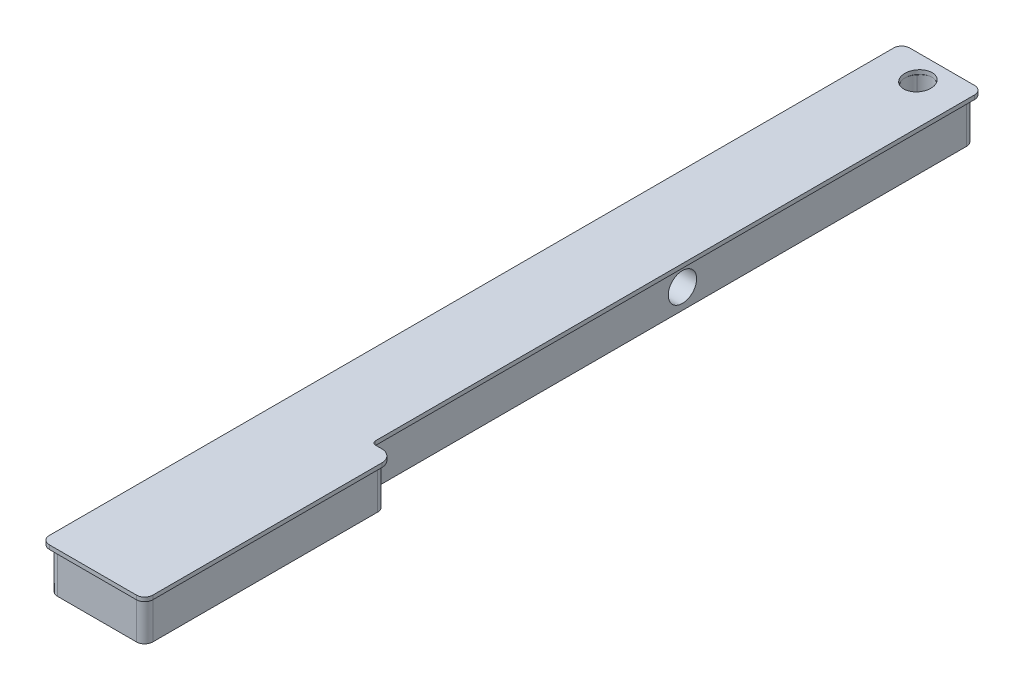
ISO-10303-21;
HEADER;
FILE_DESCRIPTION(('STEP AP214'),'2;1');
FILE_NAME('part.step','',(''),(''),'','','');
FILE_SCHEMA(('AUTOMOTIVE_DESIGN { 1 0 10303 214 1 1 1 1 }'));
ENDSEC;
DATA;
#1=APPLICATION_CONTEXT('core data for automotive mechanical design processes');
#2=APPLICATION_PROTOCOL_DEFINITION('international standard','automotive_design',2000,#1);
#3=PRODUCT_CONTEXT('',#1,'mechanical');
#4=PRODUCT('Part','Part','',(#3));
#5=PRODUCT_RELATED_PRODUCT_CATEGORY('part','',(#4));
#6=PRODUCT_DEFINITION_FORMATION('','',#4);
#7=PRODUCT_DEFINITION_CONTEXT('part definition',#1,'design');
#8=PRODUCT_DEFINITION('design','',#6,#7);
#9=PRODUCT_DEFINITION_SHAPE('','',#8);
#10=(LENGTH_UNIT() NAMED_UNIT(*) SI_UNIT(.MILLI.,.METRE.));
#11=(NAMED_UNIT(*) PLANE_ANGLE_UNIT() SI_UNIT($,.RADIAN.));
#12=(NAMED_UNIT(*) SI_UNIT($,.STERADIAN.) SOLID_ANGLE_UNIT());
#13=UNCERTAINTY_MEASURE_WITH_UNIT(LENGTH_MEASURE(1.E-05),#10,'distance_accuracy_value','');
#14=(GEOMETRIC_REPRESENTATION_CONTEXT(3) GLOBAL_UNCERTAINTY_ASSIGNED_CONTEXT((#13)) GLOBAL_UNIT_ASSIGNED_CONTEXT((#10,
#11,#12)) REPRESENTATION_CONTEXT('',''));
#15=CARTESIAN_POINT('',(0.,0.,0.));
#16=DIRECTION('',(0.,0.,1.));
#17=DIRECTION('',(1.,0.,0.));
#18=AXIS2_PLACEMENT_3D('',#15,#16,#17);
#19=CARTESIAN_POINT('',(-2.35185760733097,0.,-100.));
#20=DIRECTION('',(0.,1.,0.));
#21=DIRECTION('',(0.,0.,1.));
#22=AXIS2_PLACEMENT_3D('',#19,#20,#21);
#23=CYLINDRICAL_SURFACE('',#22,3.2);
#24=CARTESIAN_POINT('',(-2.35185760733097,10.,-100.));
#25=DIRECTION('',(0.,-1.,0.));
#26=DIRECTION('',(0.,0.,-1.));
#27=AXIS2_PLACEMENT_3D('',#24,#25,#26);
#28=CIRCLE('',#27,3.2);
#29=CARTESIAN_POINT('',(-4.71112737701685,10.,-102.161907989218));
#30=VERTEX_POINT('',#29);
#31=CARTESIAN_POINT('',(-5.55185760733097,10.,-100.));
#32=VERTEX_POINT('',#31);
#33=EDGE_CURVE('E48',#30,#32,#28,.F.);
#34=ORIENTED_EDGE('',*,*,#33,.T.);
#35=CARTESIAN_POINT('',(-4.71112737701678,10.,-97.8380920107816));
#36=VERTEX_POINT('',#35);
#37=EDGE_CURVE('E11',#32,#36,#28,.F.);
#38=ORIENTED_EDGE('',*,*,#37,.T.);
#39=DIRECTION('',(0.,1.,0.));
#40=VECTOR('',#39,1.);
#41=CARTESIAN_POINT('',(-4.71112737701686,0.,-97.8380920107817));
#42=LINE('',#41,#40);
#43=CARTESIAN_POINT('',(-4.71112737701686,0.,-97.8380920107817));
#44=VERTEX_POINT('',#43);
#45=EDGE_CURVE('E271',#44,#36,#42,.T.);
#46=ORIENTED_EDGE('',*,*,#45,.F.);
#47=CARTESIAN_POINT('',(-2.35185760733097,0.,-100.));
#48=DIRECTION('',(0.,1.,0.));
#49=DIRECTION('',(0.,0.,1.));
#50=AXIS2_PLACEMENT_3D('',#47,#48,#49);
#51=CIRCLE('',#50,3.2);
#52=CARTESIAN_POINT('',(-4.71112737701686,0.,-102.161907989218));
#53=VERTEX_POINT('',#52);
#54=EDGE_CURVE('E287',#53,#44,#51,.T.);
#55=ORIENTED_EDGE('',*,*,#54,.F.);
#56=DIRECTION('',(0.,1.,0.));
#57=VECTOR('',#56,1.);
#58=CARTESIAN_POINT('',(-4.71112737701686,0.,-102.161907989218));
#59=LINE('',#58,#57);
#60=EDGE_CURVE('E497',#30,#53,#59,.F.);
#61=ORIENTED_EDGE('',*,*,#60,.F.);
#62=EDGE_LOOP('',(#34,#38,#46,#55,#61));
#63=FACE_BOUND('',#62,.T.);
#64=ADVANCED_FACE('F39',(#63),#23,.F.);
#65=CARTESIAN_POINT('',(-2.35185760733097,0.,-100.));
#66=DIRECTION('',(0.,1.,0.));
#67=DIRECTION('',(0.,0.,-1.));
#68=AXIS2_PLACEMENT_3D('',#65,#66,#67);
#69=ELLIPSE('',#68,3.5,2.99999999999999);
#70=DIRECTION('',(0.,1.,0.));
#71=VECTOR('',#70,1.);
#72=SURFACE_OF_LINEAR_EXTRUSION('',#69,#71);
#73=CARTESIAN_POINT('',(-2.35185760733097,10.,-100.));
#74=DIRECTION('',(0.,1.,0.));
#75=DIRECTION('',(0.,0.,-1.));
#76=AXIS2_PLACEMENT_3D('',#73,#74,#75);
#77=ELLIPSE('',#76,3.5,2.99999999999999);
#78=CARTESIAN_POINT('',(-2.35185760733097,10.,-96.5000000000001));
#79=VERTEX_POINT('',#78);
#80=EDGE_CURVE('E265',#36,#79,#77,.T.);
#81=ORIENTED_EDGE('',*,*,#80,.T.);
#82=CARTESIAN_POINT('',(-2.35185760733097,10.,-100.));
#83=DIRECTION('',(0.,1.,0.));
#84=DIRECTION('',(0.,0.,-1.));
#85=AXIS2_PLACEMENT_3D('',#82,#83,#84);
#86=ELLIPSE('',#85,3.5,2.99999999999999);
#87=CARTESIAN_POINT('',(0.00741216235491515,10.,-97.8380920107817));
#88=VERTEX_POINT('',#87);
#89=EDGE_CURVE('E238',#79,#88,#86,.T.);
#90=ORIENTED_EDGE('',*,*,#89,.T.);
#91=DIRECTION('',(0.,1.,0.));
#92=VECTOR('',#91,1.);
#93=CARTESIAN_POINT('',(0.00741216235491688,0.,-97.8380920107817));
#94=LINE('',#93,#92);
#95=CARTESIAN_POINT('',(0.00741216235492122,0.,-97.8380920107817));
#96=VERTEX_POINT('',#95);
#97=EDGE_CURVE('E392',#88,#96,#94,.F.);
#98=ORIENTED_EDGE('',*,*,#97,.T.);
#99=EDGE_CURVE('E277',#44,#96,#69,.T.);
#100=ORIENTED_EDGE('',*,*,#99,.F.);
#101=ORIENTED_EDGE('',*,*,#45,.T.);
#102=EDGE_LOOP('',(#81,#90,#98,#100,#101));
#103=FACE_BOUND('',#102,.T.);
#104=ADVANCED_FACE('F269',(#103),#72,.F.);
#105=CARTESIAN_POINT('',(-11.3462483619855,10.,-33.0000000000001));
#106=DIRECTION('',(1.,0.,0.));
#107=DIRECTION('',(0.,0.,-1.));
#108=AXIS2_PLACEMENT_3D('',#105,#106,#107);
#109=PLANE('',#108);
#110=CARTESIAN_POINT('',(-11.3462483619855,4.99999999999999,-33.0000000000001));
#111=DIRECTION('',(1.,0.,0.));
#112=DIRECTION('',(0.,0.,-1.));
#113=AXIS2_PLACEMENT_3D('',#110,#111,#112);
#114=CIRCLE('',#113,3.5);
#115=CARTESIAN_POINT('',(-11.3462483619855,4.99999999999999,-36.5000000000001));
#116=VERTEX_POINT('',#115);
#117=EDGE_CURVE('E719',#116,#116,#114,.T.);
#118=ORIENTED_EDGE('',*,*,#117,.T.);
#119=EDGE_LOOP('',(#118));
#120=FACE_BOUND('',#119,.T.);
#121=DIRECTION('',(0.,0.,1.));
#122=VECTOR('',#121,1.);
#123=CARTESIAN_POINT('',(-11.3462483619855,10.,-33.0000000000001));
#124=LINE('',#123,#122);
#125=CARTESIAN_POINT('',(-11.3462483619855,10.,-103.));
#126=VERTEX_POINT('',#125);
#127=CARTESIAN_POINT('',(-11.3462483619855,10.,103.));
#128=VERTEX_POINT('',#127);
#129=EDGE_CURVE('E725',#126,#128,#124,.T.);
#130=ORIENTED_EDGE('',*,*,#129,.F.);
#131=DIRECTION('',(0.,-1.,0.));
#132=VECTOR('',#131,1.);
#133=CARTESIAN_POINT('',(-11.3462483619855,10.,-103.));
#134=LINE('',#133,#132);
#135=CARTESIAN_POINT('',(-11.3462483619855,0.,-103.));
#136=VERTEX_POINT('',#135);
#137=EDGE_CURVE('E437',#126,#136,#134,.T.);
#138=ORIENTED_EDGE('',*,*,#137,.T.);
#139=DIRECTION('',(0.,0.,1.));
#140=VECTOR('',#139,1.);
#141=CARTESIAN_POINT('',(-11.3462483619855,0.,-33.0000000000001));
#142=LINE('',#141,#140);
#143=CARTESIAN_POINT('',(-11.3462483619855,0.,103.));
#144=VERTEX_POINT('',#143);
#145=EDGE_CURVE('E722',#136,#144,#142,.T.);
#146=ORIENTED_EDGE('',*,*,#145,.T.);
#147=DIRECTION('',(0.,-1.,0.));
#148=VECTOR('',#147,1.);
#149=CARTESIAN_POINT('',(-11.3462483619855,10.,103.));
#150=LINE('',#149,#148);
#151=EDGE_CURVE('E435',#144,#128,#150,.F.);
#152=ORIENTED_EDGE('',*,*,#151,.T.);
#153=EDGE_LOOP('',(#130,#138,#146,#152));
#154=FACE_BOUND('',#153,.T.);
#155=ADVANCED_FACE('F331',(#120,#154),#109,.F.);
#156=CARTESIAN_POINT('',(-11.3462483619855,10.,105.));
#157=DIRECTION('',(0.,0.,-1.));
#158=DIRECTION('',(-1.,0.,0.));
#159=AXIS2_PLACEMENT_3D('',#156,#157,#158);
#160=PLANE('',#159);
#161=DIRECTION('',(1.,0.,0.));
#162=VECTOR('',#161,1.);
#163=CARTESIAN_POINT('',(-11.3462483619855,10.,105.));
#164=LINE('',#163,#162);
#165=CARTESIAN_POINT('',(-9.34624836198546,10.,105.));
#166=VERTEX_POINT('',#165);
#167=CARTESIAN_POINT('',(10.1337516380145,10.,105.));
#168=VERTEX_POINT('',#167);
#169=EDGE_CURVE('E728',#166,#168,#164,.T.);
#170=ORIENTED_EDGE('',*,*,#169,.F.);
#171=DIRECTION('',(0.,-1.,0.));
#172=VECTOR('',#171,1.);
#173=CARTESIAN_POINT('',(-9.34624836198546,10.,105.));
#174=LINE('',#173,#172);
#175=CARTESIAN_POINT('',(-9.34624836198546,0.,105.));
#176=VERTEX_POINT('',#175);
#177=EDGE_CURVE('E452',#166,#176,#174,.T.);
#178=ORIENTED_EDGE('',*,*,#177,.T.);
#179=DIRECTION('',(1.,0.,0.));
#180=VECTOR('',#179,1.);
#181=CARTESIAN_POINT('',(-11.3462483619855,0.,105.));
#182=LINE('',#181,#180);
#183=CARTESIAN_POINT('',(10.1337516380145,0.,105.));
#184=VERTEX_POINT('',#183);
#185=EDGE_CURVE('E746',#176,#184,#182,.T.);
#186=ORIENTED_EDGE('',*,*,#185,.T.);
#187=DIRECTION('',(0.,-1.,0.));
#188=VECTOR('',#187,1.);
#189=CARTESIAN_POINT('',(10.1337516380145,10.,105.));
#190=LINE('',#189,#188);
#191=EDGE_CURVE('E450',#184,#168,#190,.F.);
#192=ORIENTED_EDGE('',*,*,#191,.T.);
#193=EDGE_LOOP('',(#170,#178,#186,#192));
#194=FACE_BOUND('',#193,.T.);
#195=ADVANCED_FACE('F327',(#194),#160,.F.);
#196=CARTESIAN_POINT('',(12.1337516380145,10.,45.5658663131516));
#197=DIRECTION('',(-1.,0.,0.));
#198=DIRECTION('',(0.,0.,1.));
#199=AXIS2_PLACEMENT_3D('',#196,#197,#198);
#200=PLANE('',#199);
#201=DIRECTION('',(0.,0.,-1.));
#202=VECTOR('',#201,1.);
#203=CARTESIAN_POINT('',(12.1337516380145,0.,45.5658663131516));
#204=LINE('',#203,#202);
#205=CARTESIAN_POINT('',(12.1337516380145,0.,103.));
#206=VERTEX_POINT('',#205);
#207=CARTESIAN_POINT('',(12.1337516380145,0.,47.5658663131516));
#208=VERTEX_POINT('',#207);
#209=EDGE_CURVE('E749',#206,#208,#204,.T.);
#210=ORIENTED_EDGE('',*,*,#209,.T.);
#211=DIRECTION('',(0.,-1.,0.));
#212=VECTOR('',#211,1.);
#213=CARTESIAN_POINT('',(12.1337516380145,10.,47.5658663131516));
#214=LINE('',#213,#212);
#215=CARTESIAN_POINT('',(12.1337516380145,10.,47.5658663131516));
#216=VERTEX_POINT('',#215);
#217=EDGE_CURVE('E448',#208,#216,#214,.F.);
#218=ORIENTED_EDGE('',*,*,#217,.T.);
#219=DIRECTION('',(0.,0.,-1.));
#220=VECTOR('',#219,1.);
#221=CARTESIAN_POINT('',(12.1337516380145,10.,45.5658663131516));
#222=LINE('',#221,#220);
#223=CARTESIAN_POINT('',(12.1337516380145,10.,103.));
#224=VERTEX_POINT('',#223);
#225=EDGE_CURVE('E732',#224,#216,#222,.T.);
#226=ORIENTED_EDGE('',*,*,#225,.F.);
#227=DIRECTION('',(0.,-1.,0.));
#228=VECTOR('',#227,1.);
#229=CARTESIAN_POINT('',(12.1337516380145,10.,103.));
#230=LINE('',#229,#228);
#231=EDGE_CURVE('E445',#224,#206,#230,.T.);
#232=ORIENTED_EDGE('',*,*,#231,.T.);
#233=EDGE_LOOP('',(#210,#218,#226,#232));
#234=FACE_BOUND('',#233,.T.);
#235=ADVANCED_FACE('F323',(#234),#200,.F.);
#236=CARTESIAN_POINT('',(6.635965382195,10.,45.5658663131516));
#237=DIRECTION('',(0.,0.,1.));
#238=DIRECTION('',(1.,0.,0.));
#239=AXIS2_PLACEMENT_3D('',#236,#237,#238);
#240=PLANE('',#239);
#241=DIRECTION('',(-1.,0.,0.));
#242=VECTOR('',#241,1.);
#243=CARTESIAN_POINT('',(6.635965382195,0.,45.5658663131516));
#244=LINE('',#243,#242);
#245=CARTESIAN_POINT('',(10.1337516380145,0.,45.5658663131516));
#246=VERTEX_POINT('',#245);
#247=CARTESIAN_POINT('',(8.63596538219499,0.,45.5658663131516));
#248=VERTEX_POINT('',#247);
#249=EDGE_CURVE('E752',#246,#248,#244,.T.);
#250=ORIENTED_EDGE('',*,*,#249,.T.);
#251=DIRECTION('',(0.,-1.,0.));
#252=VECTOR('',#251,1.);
#253=CARTESIAN_POINT('',(8.63596538219499,10.,45.5658663131516));
#254=LINE('',#253,#252);
#255=CARTESIAN_POINT('',(8.63596538219499,10.,45.5658663131516));
#256=VERTEX_POINT('',#255);
#257=EDGE_CURVE('E443',#248,#256,#254,.F.);
#258=ORIENTED_EDGE('',*,*,#257,.T.);
#259=DIRECTION('',(-1.,0.,0.));
#260=VECTOR('',#259,1.);
#261=CARTESIAN_POINT('',(6.635965382195,10.,45.5658663131516));
#262=LINE('',#261,#260);
#263=CARTESIAN_POINT('',(10.1337516380145,10.,45.5658663131516));
#264=VERTEX_POINT('',#263);
#265=EDGE_CURVE('E735',#264,#256,#262,.T.);
#266=ORIENTED_EDGE('',*,*,#265,.F.);
#267=DIRECTION('',(0.,-1.,0.));
#268=VECTOR('',#267,1.);
#269=CARTESIAN_POINT('',(10.1337516380145,10.,45.5658663131516));
#270=LINE('',#269,#268);
#271=EDGE_CURVE('E440',#264,#246,#270,.T.);
#272=ORIENTED_EDGE('',*,*,#271,.T.);
#273=EDGE_LOOP('',(#250,#258,#266,#272));
#274=FACE_BOUND('',#273,.T.);
#275=ADVANCED_FACE('F319',(#274),#240,.F.);
#276=CARTESIAN_POINT('',(6.63596538219499,10.,-105.));
#277=DIRECTION('',(-1.,0.,0.));
#278=DIRECTION('',(0.,0.,1.));
#279=AXIS2_PLACEMENT_3D('',#276,#277,#278);
#280=PLANE('',#279);
#281=CARTESIAN_POINT('',(6.63596538219499,4.99999999999999,-33.0000000000001));
#282=DIRECTION('',(1.,0.,0.));
#283=DIRECTION('',(0.,0.,-1.));
#284=AXIS2_PLACEMENT_3D('',#281,#282,#283);
#285=CIRCLE('',#284,3.5);
#286=CARTESIAN_POINT('',(6.63596538219499,4.99999999999999,-36.5000000000001));
#287=VERTEX_POINT('',#286);
#288=EDGE_CURVE('E717',#287,#287,#285,.T.);
#289=ORIENTED_EDGE('',*,*,#288,.F.);
#290=EDGE_LOOP('',(#289));
#291=FACE_BOUND('',#290,.T.);
#292=DIRECTION('',(0.,0.,-1.));
#293=VECTOR('',#292,1.);
#294=CARTESIAN_POINT('',(6.63596538219499,0.,-105.));
#295=LINE('',#294,#293);
#296=CARTESIAN_POINT('',(6.63596538219499,0.,43.5658663131516));
#297=VERTEX_POINT('',#296);
#298=CARTESIAN_POINT('',(6.63596538219499,0.,-103.));
#299=VERTEX_POINT('',#298);
#300=EDGE_CURVE('E755',#297,#299,#295,.T.);
#301=ORIENTED_EDGE('',*,*,#300,.T.);
#302=DIRECTION('',(0.,-1.,0.));
#303=VECTOR('',#302,1.);
#304=CARTESIAN_POINT('',(6.63596538219499,10.,-103.));
#305=LINE('',#304,#303);
#306=CARTESIAN_POINT('',(6.635965382195,10.,-103.));
#307=VERTEX_POINT('',#306);
#308=EDGE_CURVE('E418',#299,#307,#305,.F.);
#309=ORIENTED_EDGE('',*,*,#308,.T.);
#310=DIRECTION('',(0.,0.,-1.));
#311=VECTOR('',#310,1.);
#312=CARTESIAN_POINT('',(6.635965382195,10.,45.0032966559117));
#313=LINE('',#312,#311);
#314=CARTESIAN_POINT('',(6.635965382195,10.,43.5658663131516));
#315=VERTEX_POINT('',#314);
#316=EDGE_CURVE('E738',#315,#307,#313,.T.);
#317=ORIENTED_EDGE('',*,*,#316,.F.);
#318=DIRECTION('',(0.,-1.,0.));
#319=VECTOR('',#318,1.);
#320=CARTESIAN_POINT('',(6.63596538219499,0.,43.5658663131516));
#321=LINE('',#320,#319);
#322=EDGE_CURVE('E415',#315,#297,#321,.T.);
#323=ORIENTED_EDGE('',*,*,#322,.T.);
#324=EDGE_LOOP('',(#301,#309,#317,#323));
#325=FACE_BOUND('',#324,.T.);
#326=ADVANCED_FACE('F315',(#291,#325),#280,.F.);
#327=CARTESIAN_POINT('',(-11.3462483619855,10.,-105.));
#328=DIRECTION('',(0.,0.,1.));
#329=DIRECTION('',(1.,0.,0.));
#330=AXIS2_PLACEMENT_3D('',#327,#328,#329);
#331=PLANE('',#330);
#332=DIRECTION('',(-1.,0.,0.));
#333=VECTOR('',#332,1.);
#334=CARTESIAN_POINT('',(-11.3462483619855,10.,-105.));
#335=LINE('',#334,#333);
#336=CARTESIAN_POINT('',(4.63596538219499,10.,-105.));
#337=VERTEX_POINT('',#336);
#338=CARTESIAN_POINT('',(-9.34624836198549,10.,-105.));
#339=VERTEX_POINT('',#338);
#340=EDGE_CURVE('E741',#337,#339,#335,.T.);
#341=ORIENTED_EDGE('',*,*,#340,.F.);
#342=DIRECTION('',(0.,-1.,0.));
#343=VECTOR('',#342,1.);
#344=CARTESIAN_POINT('',(4.63596538219499,10.,-105.));
#345=LINE('',#344,#343);
#346=CARTESIAN_POINT('',(4.63596538219499,0.,-105.));
#347=VERTEX_POINT('',#346);
#348=EDGE_CURVE('E397',#337,#347,#345,.T.);
#349=ORIENTED_EDGE('',*,*,#348,.T.);
#350=DIRECTION('',(-1.,0.,0.));
#351=VECTOR('',#350,1.);
#352=CARTESIAN_POINT('',(-11.3462483619855,0.,-105.));
#353=LINE('',#352,#351);
#354=CARTESIAN_POINT('',(-9.34624836198549,0.,-105.));
#355=VERTEX_POINT('',#354);
#356=EDGE_CURVE('E729',#347,#355,#353,.T.);
#357=ORIENTED_EDGE('',*,*,#356,.T.);
#358=DIRECTION('',(0.,-1.,0.));
#359=VECTOR('',#358,1.);
#360=CARTESIAN_POINT('',(-9.34624836198549,10.,-105.));
#361=LINE('',#360,#359);
#362=EDGE_CURVE('E394',#355,#339,#361,.F.);
#363=ORIENTED_EDGE('',*,*,#362,.T.);
#364=EDGE_LOOP('',(#341,#349,#357,#363));
#365=FACE_BOUND('',#364,.T.);
#366=ADVANCED_FACE('F312',(#365),#331,.F.);
#367=CARTESIAN_POINT('',(0.,0.,0.));
#368=DIRECTION('',(0.,-1.,0.));
#369=DIRECTION('',(0.,0.,-1.));
#370=AXIS2_PLACEMENT_3D('',#367,#368,#369);
#371=PLANE('',#370);
#372=CARTESIAN_POINT('',(0.00741216235492122,0.,-102.161907989218));
#373=VERTEX_POINT('',#372);
#374=EDGE_CURVE('E282',#96,#373,#51,.T.);
#375=ORIENTED_EDGE('',*,*,#374,.T.);
#376=EDGE_CURVE('E272',#373,#53,#69,.T.);
#377=ORIENTED_EDGE('',*,*,#376,.T.);
#378=ORIENTED_EDGE('',*,*,#54,.T.);
#379=ORIENTED_EDGE('',*,*,#99,.T.);
#380=EDGE_LOOP('',(#375,#377,#378,#379));
#381=FACE_BOUND('',#380,.T.);
#382=ORIENTED_EDGE('',*,*,#356,.F.);
#383=CARTESIAN_POINT('',(4.63596538219499,0.,-103.));
#384=DIRECTION('',(0.,-1.,0.));
#385=DIRECTION('',(0.,0.,-1.));
#386=AXIS2_PLACEMENT_3D('',#383,#384,#385);
#387=CIRCLE('',#386,2.);
#388=EDGE_CURVE('E413',#347,#299,#387,.T.);
#389=ORIENTED_EDGE('',*,*,#388,.T.);
#390=ORIENTED_EDGE('',*,*,#300,.F.);
#391=CARTESIAN_POINT('',(8.63596538219499,0.,43.5658663131516));
#392=DIRECTION('',(0.,-1.,0.));
#393=DIRECTION('',(0.,0.,-1.));
#394=AXIS2_PLACEMENT_3D('',#391,#392,#393);
#395=CIRCLE('',#394,2.);
#396=EDGE_CURVE('E455',#297,#248,#395,.F.);
#397=ORIENTED_EDGE('',*,*,#396,.T.);
#398=ORIENTED_EDGE('',*,*,#249,.F.);
#399=CARTESIAN_POINT('',(10.1337516380145,0.,47.5658663131516));
#400=DIRECTION('',(0.,-1.,0.));
#401=DIRECTION('',(0.,0.,-1.));
#402=AXIS2_PLACEMENT_3D('',#399,#400,#401);
#403=CIRCLE('',#402,2.);
#404=EDGE_CURVE('E409',#246,#208,#403,.T.);
#405=ORIENTED_EDGE('',*,*,#404,.T.);
#406=ORIENTED_EDGE('',*,*,#209,.F.);
#407=CARTESIAN_POINT('',(10.1337516380145,0.,103.));
#408=DIRECTION('',(0.,-1.,0.));
#409=DIRECTION('',(0.,0.,-1.));
#410=AXIS2_PLACEMENT_3D('',#407,#408,#409);
#411=CIRCLE('',#410,2.);
#412=EDGE_CURVE('E405',#206,#184,#411,.T.);
#413=ORIENTED_EDGE('',*,*,#412,.T.);
#414=ORIENTED_EDGE('',*,*,#185,.F.);
#415=CARTESIAN_POINT('',(-9.34624836198546,0.,103.));
#416=DIRECTION('',(0.,-1.,0.));
#417=DIRECTION('',(0.,0.,-1.));
#418=AXIS2_PLACEMENT_3D('',#415,#416,#417);
#419=CIRCLE('',#418,2.);
#420=EDGE_CURVE('E407',#176,#144,#419,.T.);
#421=ORIENTED_EDGE('',*,*,#420,.T.);
#422=ORIENTED_EDGE('',*,*,#145,.F.);
#423=CARTESIAN_POINT('',(-9.34624836198549,0.,-103.));
#424=DIRECTION('',(0.,-1.,0.));
#425=DIRECTION('',(0.,0.,-1.));
#426=AXIS2_PLACEMENT_3D('',#423,#424,#425);
#427=CIRCLE('',#426,2.);
#428=EDGE_CURVE('E411',#136,#355,#427,.T.);
#429=ORIENTED_EDGE('',*,*,#428,.T.);
#430=EDGE_LOOP('',(#382,#389,#390,#397,#398,#405,#406,#413,#414,#421,#422,#429));
#431=FACE_BOUND('',#430,.T.);
#432=ADVANCED_FACE('F308',(#381,#431),#371,.T.);
#433=CARTESIAN_POINT('',(-67.364034617805,4.99999999999999,-33.0000000000001));
#434=DIRECTION('',(1.,0.,0.));
#435=DIRECTION('',(0.,0.,-1.));
#436=AXIS2_PLACEMENT_3D('',#433,#434,#435);
#437=CYLINDRICAL_SURFACE('',#436,3.5);
#438=ORIENTED_EDGE('',*,*,#288,.T.);
#439=EDGE_LOOP('',(#438));
#440=FACE_BOUND('',#439,.T.);
#441=ORIENTED_EDGE('',*,*,#117,.F.);
#442=EDGE_LOOP('',(#441));
#443=FACE_BOUND('',#442,.T.);
#444=ADVANCED_FACE('F304',(#440,#443),#437,.F.);
#445=ORIENTED_EDGE('',*,*,#376,.F.);
#446=DIRECTION('',(0.,1.,0.));
#447=VECTOR('',#446,1.);
#448=CARTESIAN_POINT('',(0.00741216235491948,0.,-102.161907989218));
#449=LINE('',#448,#447);
#450=CARTESIAN_POINT('',(0.00741216235485139,10.,-102.161907989219));
#451=VERTEX_POINT('',#450);
#452=EDGE_CURVE('E395',#373,#451,#449,.T.);
#453=ORIENTED_EDGE('',*,*,#452,.T.);
#454=CARTESIAN_POINT('',(-2.35185760733097,10.,-103.5));
#455=VERTEX_POINT('',#454);
#456=EDGE_CURVE('E273',#451,#455,#77,.T.);
#457=ORIENTED_EDGE('',*,*,#456,.T.);
#458=EDGE_CURVE('E275',#455,#30,#77,.T.);
#459=ORIENTED_EDGE('',*,*,#458,.T.);
#460=ORIENTED_EDGE('',*,*,#60,.T.);
#461=EDGE_LOOP('',(#445,#453,#457,#459,#460));
#462=FACE_BOUND('',#461,.T.);
#463=ADVANCED_FACE('F299',(#462),#72,.F.);
#464=ORIENTED_EDGE('',*,*,#97,.F.);
#465=CARTESIAN_POINT('',(0.848142392669032,10.,-100.));
#466=VERTEX_POINT('',#465);
#467=EDGE_CURVE('E244',#88,#466,#28,.F.);
#468=ORIENTED_EDGE('',*,*,#467,.T.);
#469=EDGE_CURVE('E43',#466,#451,#28,.F.);
#470=ORIENTED_EDGE('',*,*,#469,.T.);
#471=ORIENTED_EDGE('',*,*,#452,.F.);
#472=ORIENTED_EDGE('',*,*,#374,.F.);
#473=EDGE_LOOP('',(#464,#468,#470,#471,#472));
#474=FACE_BOUND('',#473,.T.);
#475=ADVANCED_FACE('F303',(#474),#23,.F.);
#476=CARTESIAN_POINT('',(4.63596538219499,10.,-103.));
#477=DIRECTION('',(0.,-1.,0.));
#478=DIRECTION('',(0.,0.,-1.));
#479=AXIS2_PLACEMENT_3D('',#476,#477,#478);
#480=CYLINDRICAL_SURFACE('',#479,2.);
#481=CARTESIAN_POINT('',(4.63596538219499,10.,-103.));
#482=DIRECTION('',(0.,-1.,0.));
#483=DIRECTION('',(0.,0.,-1.));
#484=AXIS2_PLACEMENT_3D('',#481,#482,#483);
#485=CIRCLE('',#484,2.);
#486=EDGE_CURVE('E432',#307,#337,#485,.F.);
#487=ORIENTED_EDGE('',*,*,#486,.F.);
#488=ORIENTED_EDGE('',*,*,#308,.F.);
#489=ORIENTED_EDGE('',*,*,#388,.F.);
#490=ORIENTED_EDGE('',*,*,#348,.F.);
#491=EDGE_LOOP('',(#487,#488,#489,#490));
#492=FACE_BOUND('',#491,.T.);
#493=ADVANCED_FACE('F336',(#492),#480,.T.);
#494=CARTESIAN_POINT('',(-9.34624836198549,10.,-103.));
#495=DIRECTION('',(0.,-1.,0.));
#496=DIRECTION('',(0.,0.,-1.));
#497=AXIS2_PLACEMENT_3D('',#494,#495,#496);
#498=CYLINDRICAL_SURFACE('',#497,2.);
#499=CARTESIAN_POINT('',(-9.34624836198549,10.,-103.));
#500=DIRECTION('',(0.,-1.,0.));
#501=DIRECTION('',(0.,0.,-1.));
#502=AXIS2_PLACEMENT_3D('',#499,#500,#501);
#503=CIRCLE('',#502,2.);
#504=EDGE_CURVE('E429',#339,#126,#503,.F.);
#505=ORIENTED_EDGE('',*,*,#504,.F.);
#506=ORIENTED_EDGE('',*,*,#362,.F.);
#507=ORIENTED_EDGE('',*,*,#428,.F.);
#508=ORIENTED_EDGE('',*,*,#137,.F.);
#509=EDGE_LOOP('',(#505,#506,#507,#508));
#510=FACE_BOUND('',#509,.T.);
#511=ADVANCED_FACE('F339',(#510),#498,.T.);
#512=CARTESIAN_POINT('',(8.63596538219499,10.,43.5658663131516));
#513=DIRECTION('',(0.,1.,0.));
#514=DIRECTION('',(0.,0.,1.));
#515=AXIS2_PLACEMENT_3D('',#512,#513,#514);
#516=CYLINDRICAL_SURFACE('',#515,2.);
#517=CARTESIAN_POINT('',(8.63596538219499,10.,43.5658663131516));
#518=DIRECTION('',(0.,-1.,0.));
#519=DIRECTION('',(0.,0.,-1.));
#520=AXIS2_PLACEMENT_3D('',#517,#518,#519);
#521=CIRCLE('',#520,2.);
#522=EDGE_CURVE('E457',#256,#315,#521,.T.);
#523=ORIENTED_EDGE('',*,*,#522,.F.);
#524=ORIENTED_EDGE('',*,*,#257,.F.);
#525=ORIENTED_EDGE('',*,*,#396,.F.);
#526=ORIENTED_EDGE('',*,*,#322,.F.);
#527=EDGE_LOOP('',(#523,#524,#525,#526));
#528=FACE_BOUND('',#527,.T.);
#529=ADVANCED_FACE('F343',(#528),#516,.F.);
#530=CARTESIAN_POINT('',(10.1337516380145,10.,47.5658663131516));
#531=DIRECTION('',(0.,-1.,0.));
#532=DIRECTION('',(0.,0.,-1.));
#533=AXIS2_PLACEMENT_3D('',#530,#531,#532);
#534=CYLINDRICAL_SURFACE('',#533,2.);
#535=CARTESIAN_POINT('',(10.1337516380145,10.,47.5658663131516));
#536=DIRECTION('',(0.,-1.,0.));
#537=DIRECTION('',(0.,0.,-1.));
#538=AXIS2_PLACEMENT_3D('',#535,#536,#537);
#539=CIRCLE('',#538,2.);
#540=EDGE_CURVE('E426',#216,#264,#539,.F.);
#541=ORIENTED_EDGE('',*,*,#540,.F.);
#542=ORIENTED_EDGE('',*,*,#217,.F.);
#543=ORIENTED_EDGE('',*,*,#404,.F.);
#544=ORIENTED_EDGE('',*,*,#271,.F.);
#545=EDGE_LOOP('',(#541,#542,#543,#544));
#546=FACE_BOUND('',#545,.T.);
#547=ADVANCED_FACE('F347',(#546),#534,.T.);
#548=CARTESIAN_POINT('',(-9.34624836198546,10.,103.));
#549=DIRECTION('',(0.,-1.,0.));
#550=DIRECTION('',(0.,0.,-1.));
#551=AXIS2_PLACEMENT_3D('',#548,#549,#550);
#552=CYLINDRICAL_SURFACE('',#551,2.);
#553=CARTESIAN_POINT('',(-9.34624836198546,10.,103.));
#554=DIRECTION('',(0.,-1.,0.));
#555=DIRECTION('',(0.,0.,-1.));
#556=AXIS2_PLACEMENT_3D('',#553,#554,#555);
#557=CIRCLE('',#556,2.);
#558=EDGE_CURVE('E423',#128,#166,#557,.F.);
#559=ORIENTED_EDGE('',*,*,#558,.F.);
#560=ORIENTED_EDGE('',*,*,#151,.F.);
#561=ORIENTED_EDGE('',*,*,#420,.F.);
#562=ORIENTED_EDGE('',*,*,#177,.F.);
#563=EDGE_LOOP('',(#559,#560,#561,#562));
#564=FACE_BOUND('',#563,.T.);
#565=ADVANCED_FACE('F351',(#564),#552,.T.);
#566=CARTESIAN_POINT('',(10.1337516380145,10.,103.));
#567=DIRECTION('',(0.,-1.,0.));
#568=DIRECTION('',(0.,0.,-1.));
#569=AXIS2_PLACEMENT_3D('',#566,#567,#568);
#570=CYLINDRICAL_SURFACE('',#569,2.);
#571=CARTESIAN_POINT('',(10.1337516380145,10.,103.));
#572=DIRECTION('',(0.,-1.,0.));
#573=DIRECTION('',(0.,0.,-1.));
#574=AXIS2_PLACEMENT_3D('',#571,#572,#573);
#575=CIRCLE('',#574,2.);
#576=EDGE_CURVE('E420',#168,#224,#575,.F.);
#577=ORIENTED_EDGE('',*,*,#576,.F.);
#578=ORIENTED_EDGE('',*,*,#191,.F.);
#579=ORIENTED_EDGE('',*,*,#412,.F.);
#580=ORIENTED_EDGE('',*,*,#231,.F.);
#581=EDGE_LOOP('',(#577,#578,#579,#580));
#582=FACE_BOUND('',#581,.T.);
#583=ADVANCED_FACE('F355',(#582),#570,.T.);
#584=CARTESIAN_POINT('',(0.,11.,0.));
#585=DIRECTION('',(0.,-1.,0.));
#586=DIRECTION('',(0.,0.,-1.));
#587=AXIS2_PLACEMENT_3D('',#584,#585,#586);
#588=PLANE('',#587);
#589=CARTESIAN_POINT('',(-2.35185760733097,11.,-100.));
#590=DIRECTION('',(0.,-1.,0.));
#591=DIRECTION('',(0.,0.,1.));
#592=AXIS2_PLACEMENT_3D('',#589,#590,#591);
#593=ELLIPSE('',#592,3.5,3.2);
#594=CARTESIAN_POINT('',(-2.35185760733097,11.,-96.5000000000001));
#595=VERTEX_POINT('',#594);
#596=EDGE_CURVE('E250',#595,#595,#593,.T.);
#597=ORIENTED_EDGE('',*,*,#596,.T.);
#598=EDGE_LOOP('',(#597));
#599=FACE_BOUND('',#598,.T.);
#600=DIRECTION('',(0.,0.,-1.));
#601=VECTOR('',#600,1.);
#602=CARTESIAN_POINT('',(7.63596538219498,11.,0.));
#603=LINE('',#602,#601);
#604=CARTESIAN_POINT('',(7.63596538219498,11.,43.5658663131516));
#605=VERTEX_POINT('',#604);
#606=CARTESIAN_POINT('',(7.63596538219498,11.,-104.));
#607=VERTEX_POINT('',#606);
#608=EDGE_CURVE('E517',#605,#607,#603,.T.);
#609=ORIENTED_EDGE('',*,*,#608,.T.);
#610=CARTESIAN_POINT('',(5.63596538219498,11.,-104.));
#611=DIRECTION('',(0.,-1.,0.));
#612=DIRECTION('',(0.,0.,-1.));
#613=AXIS2_PLACEMENT_3D('',#610,#611,#612);
#614=CIRCLE('',#613,2.);
#615=CARTESIAN_POINT('',(5.63596538219498,11.,-106.));
#616=VERTEX_POINT('',#615);
#617=EDGE_CURVE('E493',#607,#616,#614,.F.);
#618=ORIENTED_EDGE('',*,*,#617,.T.);
#619=DIRECTION('',(-1.,0.,0.));
#620=VECTOR('',#619,1.);
#621=CARTESIAN_POINT('',(-12.3462483619855,11.,-106.));
#622=LINE('',#621,#620);
#623=CARTESIAN_POINT('',(-10.3462483619855,11.,-106.));
#624=VERTEX_POINT('',#623);
#625=EDGE_CURVE('E293',#616,#624,#622,.T.);
#626=ORIENTED_EDGE('',*,*,#625,.T.);
#627=CARTESIAN_POINT('',(-10.3462483619855,11.,-104.));
#628=DIRECTION('',(0.,-1.,0.));
#629=DIRECTION('',(0.,0.,-1.));
#630=AXIS2_PLACEMENT_3D('',#627,#628,#629);
#631=CIRCLE('',#630,2.);
#632=CARTESIAN_POINT('',(-12.3462483619855,11.,-104.));
#633=VERTEX_POINT('',#632);
#634=EDGE_CURVE('E477',#624,#633,#631,.F.);
#635=ORIENTED_EDGE('',*,*,#634,.T.);
#636=DIRECTION('',(0.,0.,1.));
#637=VECTOR('',#636,1.);
#638=CARTESIAN_POINT('',(-12.3462483619855,11.,106.));
#639=LINE('',#638,#637);
#640=CARTESIAN_POINT('',(-12.3462483619855,11.,104.));
#641=VERTEX_POINT('',#640);
#642=EDGE_CURVE('E535',#633,#641,#639,.T.);
#643=ORIENTED_EDGE('',*,*,#642,.T.);
#644=CARTESIAN_POINT('',(-10.3462483619855,11.,104.));
#645=DIRECTION('',(0.,-1.,0.));
#646=DIRECTION('',(0.,0.,-1.));
#647=AXIS2_PLACEMENT_3D('',#644,#645,#646);
#648=CIRCLE('',#647,2.);
#649=CARTESIAN_POINT('',(-10.3462483619855,11.,106.));
#650=VERTEX_POINT('',#649);
#651=EDGE_CURVE('E475',#641,#650,#648,.F.);
#652=ORIENTED_EDGE('',*,*,#651,.T.);
#653=DIRECTION('',(1.,0.,0.));
#654=VECTOR('',#653,1.);
#655=CARTESIAN_POINT('',(-12.3462483619855,11.,106.));
#656=LINE('',#655,#654);
#657=CARTESIAN_POINT('',(11.1337516380145,11.,106.));
#658=VERTEX_POINT('',#657);
#659=EDGE_CURVE('E538',#650,#658,#656,.T.);
#660=ORIENTED_EDGE('',*,*,#659,.T.);
#661=CARTESIAN_POINT('',(11.1337516380145,11.,104.));
#662=DIRECTION('',(0.,-1.,0.));
#663=DIRECTION('',(0.,0.,-1.));
#664=AXIS2_PLACEMENT_3D('',#661,#662,#663);
#665=CIRCLE('',#664,2.);
#666=CARTESIAN_POINT('',(13.1337516380145,11.,104.));
#667=VERTEX_POINT('',#666);
#668=EDGE_CURVE('E473',#658,#667,#665,.F.);
#669=ORIENTED_EDGE('',*,*,#668,.T.);
#670=DIRECTION('',(0.,0.,-1.));
#671=VECTOR('',#670,1.);
#672=CARTESIAN_POINT('',(13.1337516380145,11.,106.));
#673=LINE('',#672,#671);
#674=CARTESIAN_POINT('',(13.1337516380145,11.,47.5658663131516));
#675=VERTEX_POINT('',#674);
#676=EDGE_CURVE('E541',#667,#675,#673,.T.);
#677=ORIENTED_EDGE('',*,*,#676,.T.);
#678=CARTESIAN_POINT('',(10.1337516380145,11.,47.5658663131516));
#679=DIRECTION('',(0.,-1.,0.));
#680=DIRECTION('',(0.,0.,-1.));
#681=AXIS2_PLACEMENT_3D('',#678,#679,#680);
#682=CIRCLE('',#681,3.00000000000001);
#683=CARTESIAN_POINT('',(10.1337516380145,11.,44.5658663131516));
#684=VERTEX_POINT('',#683);
#685=EDGE_CURVE('E525',#675,#684,#682,.F.);
#686=ORIENTED_EDGE('',*,*,#685,.T.);
#687=DIRECTION('',(-1.,0.,0.));
#688=VECTOR('',#687,1.);
#689=CARTESIAN_POINT('',(0.,11.,44.5658663131516));
#690=LINE('',#689,#688);
#691=CARTESIAN_POINT('',(8.63596538219499,11.,44.5658663131516));
#692=VERTEX_POINT('',#691);
#693=EDGE_CURVE('E528',#684,#692,#690,.T.);
#694=ORIENTED_EDGE('',*,*,#693,.T.);
#695=CARTESIAN_POINT('',(8.63596538219499,11.,43.5658663131516));
#696=DIRECTION('',(0.,-1.,0.));
#697=DIRECTION('',(0.,0.,-1.));
#698=AXIS2_PLACEMENT_3D('',#695,#696,#697);
#699=CIRCLE('',#698,1.);
#700=EDGE_CURVE('E531',#692,#605,#699,.T.);
#701=ORIENTED_EDGE('',*,*,#700,.T.);
#702=EDGE_LOOP('',(#609,#618,#626,#635,#643,#652,#660,#669,#677,#686,#694,#701));
#703=FACE_BOUND('',#702,.T.);
#704=ADVANCED_FACE('F359',(#599,#703),#588,.F.);
#705=CARTESIAN_POINT('',(-12.3462483619855,11.,-106.));
#706=DIRECTION('',(0.,0.,1.));
#707=DIRECTION('',(1.,0.,0.));
#708=AXIS2_PLACEMENT_3D('',#705,#706,#707);
#709=PLANE('',#708);
#710=ORIENTED_EDGE('',*,*,#625,.F.);
#711=DIRECTION('',(0.,-1.,0.));
#712=VECTOR('',#711,1.);
#713=CARTESIAN_POINT('',(5.63596538219498,11.,-106.));
#714=LINE('',#713,#712);
#715=CARTESIAN_POINT('',(5.63596538219498,10.,-106.));
#716=VERTEX_POINT('',#715);
#717=EDGE_CURVE('E489',#616,#716,#714,.T.);
#718=ORIENTED_EDGE('',*,*,#717,.T.);
#719=DIRECTION('',(-1.,0.,0.));
#720=VECTOR('',#719,1.);
#721=CARTESIAN_POINT('',(-12.3462483619855,10.,-106.));
#722=LINE('',#721,#720);
#723=CARTESIAN_POINT('',(-10.3462483619855,10.,-106.));
#724=VERTEX_POINT('',#723);
#725=EDGE_CURVE('E295',#716,#724,#722,.T.);
#726=ORIENTED_EDGE('',*,*,#725,.T.);
#727=DIRECTION('',(0.,-1.,0.));
#728=VECTOR('',#727,1.);
#729=CARTESIAN_POINT('',(-10.3462483619855,11.,-106.));
#730=LINE('',#729,#728);
#731=EDGE_CURVE('E460',#724,#624,#730,.F.);
#732=ORIENTED_EDGE('',*,*,#731,.T.);
#733=EDGE_LOOP('',(#710,#718,#726,#732));
#734=FACE_BOUND('',#733,.T.);
#735=ADVANCED_FACE('F555',(#734),#709,.F.);
#736=CARTESIAN_POINT('',(13.1337516380145,11.,106.));
#737=DIRECTION('',(-1.,0.,0.));
#738=DIRECTION('',(0.,0.,1.));
#739=AXIS2_PLACEMENT_3D('',#736,#737,#738);
#740=PLANE('',#739);
#741=DIRECTION('',(0.,0.,-1.));
#742=VECTOR('',#741,1.);
#743=CARTESIAN_POINT('',(13.1337516380145,10.,106.));
#744=LINE('',#743,#742);
#745=CARTESIAN_POINT('',(13.1337516380145,10.,104.));
#746=VERTEX_POINT('',#745);
#747=CARTESIAN_POINT('',(13.1337516380145,10.,47.5658663131516));
#748=VERTEX_POINT('',#747);
#749=EDGE_CURVE('E549',#746,#748,#744,.T.);
#750=ORIENTED_EDGE('',*,*,#749,.T.);
#751=DIRECTION('',(0.,-1.,0.));
#752=VECTOR('',#751,1.);
#753=CARTESIAN_POINT('',(13.1337516380145,11.5,47.5658663131516));
#754=LINE('',#753,#752);
#755=EDGE_CURVE('E520',#675,#748,#754,.T.);
#756=ORIENTED_EDGE('',*,*,#755,.F.);
#757=ORIENTED_EDGE('',*,*,#676,.F.);
#758=DIRECTION('',(0.,-1.,0.));
#759=VECTOR('',#758,1.);
#760=CARTESIAN_POINT('',(13.1337516380145,11.,104.));
#761=LINE('',#760,#759);
#762=EDGE_CURVE('E470',#667,#746,#761,.T.);
#763=ORIENTED_EDGE('',*,*,#762,.T.);
#764=EDGE_LOOP('',(#750,#756,#757,#763));
#765=FACE_BOUND('',#764,.T.);
#766=ADVANCED_FACE('F575',(#765),#740,.F.);
#767=CARTESIAN_POINT('',(-12.3462483619855,11.,106.));
#768=DIRECTION('',(0.,0.,-1.));
#769=DIRECTION('',(-1.,0.,0.));
#770=AXIS2_PLACEMENT_3D('',#767,#768,#769);
#771=PLANE('',#770);
#772=ORIENTED_EDGE('',*,*,#659,.F.);
#773=DIRECTION('',(0.,-1.,0.));
#774=VECTOR('',#773,1.);
#775=CARTESIAN_POINT('',(-10.3462483619855,11.,106.));
#776=LINE('',#775,#774);
#777=CARTESIAN_POINT('',(-10.3462483619855,10.,106.));
#778=VERTEX_POINT('',#777);
#779=EDGE_CURVE('E486',#650,#778,#776,.T.);
#780=ORIENTED_EDGE('',*,*,#779,.T.);
#781=DIRECTION('',(1.,0.,0.));
#782=VECTOR('',#781,1.);
#783=CARTESIAN_POINT('',(-12.3462483619855,10.,106.));
#784=LINE('',#783,#782);
#785=CARTESIAN_POINT('',(11.1337516380145,10.,106.));
#786=VERTEX_POINT('',#785);
#787=EDGE_CURVE('E547',#778,#786,#784,.T.);
#788=ORIENTED_EDGE('',*,*,#787,.T.);
#789=DIRECTION('',(0.,-1.,0.));
#790=VECTOR('',#789,1.);
#791=CARTESIAN_POINT('',(11.1337516380145,11.,106.));
#792=LINE('',#791,#790);
#793=EDGE_CURVE('E484',#786,#658,#792,.F.);
#794=ORIENTED_EDGE('',*,*,#793,.T.);
#795=EDGE_LOOP('',(#772,#780,#788,#794));
#796=FACE_BOUND('',#795,.T.);
#797=ADVANCED_FACE('F570',(#796),#771,.F.);
#798=CARTESIAN_POINT('',(-12.3462483619855,11.,106.));
#799=DIRECTION('',(1.,0.,0.));
#800=DIRECTION('',(0.,0.,-1.));
#801=AXIS2_PLACEMENT_3D('',#798,#799,#800);
#802=PLANE('',#801);
#803=ORIENTED_EDGE('',*,*,#642,.F.);
#804=DIRECTION('',(0.,-1.,0.));
#805=VECTOR('',#804,1.);
#806=CARTESIAN_POINT('',(-12.3462483619855,11.,-104.));
#807=LINE('',#806,#805);
#808=CARTESIAN_POINT('',(-12.3462483619855,10.,-104.));
#809=VERTEX_POINT('',#808);
#810=EDGE_CURVE('E481',#633,#809,#807,.T.);
#811=ORIENTED_EDGE('',*,*,#810,.T.);
#812=DIRECTION('',(0.,0.,1.));
#813=VECTOR('',#812,1.);
#814=CARTESIAN_POINT('',(-12.3462483619855,10.,106.));
#815=LINE('',#814,#813);
#816=CARTESIAN_POINT('',(-12.3462483619855,10.,104.));
#817=VERTEX_POINT('',#816);
#818=EDGE_CURVE('E534',#809,#817,#815,.T.);
#819=ORIENTED_EDGE('',*,*,#818,.T.);
#820=DIRECTION('',(0.,-1.,0.));
#821=VECTOR('',#820,1.);
#822=CARTESIAN_POINT('',(-12.3462483619855,11.,104.));
#823=LINE('',#822,#821);
#824=EDGE_CURVE('E479',#817,#641,#823,.F.);
#825=ORIENTED_EDGE('',*,*,#824,.T.);
#826=EDGE_LOOP('',(#803,#811,#819,#825));
#827=FACE_BOUND('',#826,.T.);
#828=ADVANCED_FACE('F565',(#827),#802,.F.);
#829=CARTESIAN_POINT('',(0.,10.,0.));
#830=DIRECTION('',(0.,-1.,0.));
#831=DIRECTION('',(0.,0.,-1.));
#832=AXIS2_PLACEMENT_3D('',#829,#830,#831);
#833=PLANE('',#832);
#834=ORIENTED_EDGE('',*,*,#725,.F.);
#835=CARTESIAN_POINT('',(5.63596538219498,10.,-104.));
#836=DIRECTION('',(0.,-1.,0.));
#837=DIRECTION('',(0.,0.,-1.));
#838=AXIS2_PLACEMENT_3D('',#835,#836,#837);
#839=CIRCLE('',#838,2.);
#840=CARTESIAN_POINT('',(7.63596538219498,10.,-104.));
#841=VERTEX_POINT('',#840);
#842=EDGE_CURVE('E63',#716,#841,#839,.T.);
#843=ORIENTED_EDGE('',*,*,#842,.T.);
#844=DIRECTION('',(0.,0.,-1.));
#845=VECTOR('',#844,1.);
#846=CARTESIAN_POINT('',(7.63596538219498,10.,43.5658663131516));
#847=LINE('',#846,#845);
#848=CARTESIAN_POINT('',(7.63596538219498,10.,43.5658663131516));
#849=VERTEX_POINT('',#848);
#850=EDGE_CURVE('E506',#849,#841,#847,.T.);
#851=ORIENTED_EDGE('',*,*,#850,.F.);
#852=CARTESIAN_POINT('',(8.63596538219499,10.,43.5658663131516));
#853=DIRECTION('',(0.,-1.,0.));
#854=DIRECTION('',(0.,0.,-1.));
#855=AXIS2_PLACEMENT_3D('',#852,#853,#854);
#856=CIRCLE('',#855,1.);
#857=CARTESIAN_POINT('',(8.63596538219499,10.,44.5658663131516));
#858=VERTEX_POINT('',#857);
#859=EDGE_CURVE('E249',#858,#849,#856,.T.);
#860=ORIENTED_EDGE('',*,*,#859,.F.);
#861=DIRECTION('',(-1.,0.,0.));
#862=VECTOR('',#861,1.);
#863=CARTESIAN_POINT('',(8.63596538219499,10.,44.5658663131516));
#864=LINE('',#863,#862);
#865=CARTESIAN_POINT('',(10.1337516380145,10.,44.5658663131516));
#866=VERTEX_POINT('',#865);
#867=EDGE_CURVE('E511',#866,#858,#864,.T.);
#868=ORIENTED_EDGE('',*,*,#867,.F.);
#869=CARTESIAN_POINT('',(10.1337516380145,10.,47.5658663131516));
#870=DIRECTION('',(0.,1.,0.));
#871=DIRECTION('',(0.,0.,-1.));
#872=AXIS2_PLACEMENT_3D('',#869,#870,#871);
#873=CIRCLE('',#872,3.00000000000001);
#874=EDGE_CURVE('E508',#748,#866,#873,.T.);
#875=ORIENTED_EDGE('',*,*,#874,.F.);
#876=ORIENTED_EDGE('',*,*,#749,.F.);
#877=CARTESIAN_POINT('',(11.1337516380145,10.,104.));
#878=DIRECTION('',(0.,-1.,0.));
#879=DIRECTION('',(0.,0.,-1.));
#880=AXIS2_PLACEMENT_3D('',#877,#878,#879);
#881=CIRCLE('',#880,2.);
#882=EDGE_CURVE('E463',#746,#786,#881,.T.);
#883=ORIENTED_EDGE('',*,*,#882,.T.);
#884=ORIENTED_EDGE('',*,*,#787,.F.);
#885=CARTESIAN_POINT('',(-10.3462483619855,10.,104.));
#886=DIRECTION('',(0.,-1.,0.));
#887=DIRECTION('',(0.,0.,-1.));
#888=AXIS2_PLACEMENT_3D('',#885,#886,#887);
#889=CIRCLE('',#888,2.);
#890=EDGE_CURVE('E465',#778,#817,#889,.T.);
#891=ORIENTED_EDGE('',*,*,#890,.T.);
#892=ORIENTED_EDGE('',*,*,#818,.F.);
#893=CARTESIAN_POINT('',(-10.3462483619855,10.,-104.));
#894=DIRECTION('',(0.,-1.,0.));
#895=DIRECTION('',(0.,0.,-1.));
#896=AXIS2_PLACEMENT_3D('',#893,#894,#895);
#897=CIRCLE('',#896,2.);
#898=EDGE_CURVE('E467',#809,#724,#897,.T.);
#899=ORIENTED_EDGE('',*,*,#898,.T.);
#900=EDGE_LOOP('',(#834,#843,#851,#860,#868,#875,#876,#883,#884,#891,#892,#899));
#901=FACE_BOUND('',#900,.T.);
#902=ORIENTED_EDGE('',*,*,#522,.T.);
#903=ORIENTED_EDGE('',*,*,#316,.T.);
#904=ORIENTED_EDGE('',*,*,#486,.T.);
#905=ORIENTED_EDGE('',*,*,#340,.T.);
#906=ORIENTED_EDGE('',*,*,#504,.T.);
#907=ORIENTED_EDGE('',*,*,#129,.T.);
#908=ORIENTED_EDGE('',*,*,#558,.T.);
#909=ORIENTED_EDGE('',*,*,#169,.T.);
#910=ORIENTED_EDGE('',*,*,#576,.T.);
#911=ORIENTED_EDGE('',*,*,#225,.T.);
#912=ORIENTED_EDGE('',*,*,#540,.T.);
#913=ORIENTED_EDGE('',*,*,#265,.T.);
#914=EDGE_LOOP('',(#902,#903,#904,#905,#906,#907,#908,#909,#910,#911,#912,#913));
#915=FACE_BOUND('',#914,.T.);
#916=ADVANCED_FACE('F365',(#901,#915),#833,.T.);
#917=CARTESIAN_POINT('',(-10.3462483619855,11.,-104.));
#918=DIRECTION('',(0.,-1.,0.));
#919=DIRECTION('',(0.,0.,-1.));
#920=AXIS2_PLACEMENT_3D('',#917,#918,#919);
#921=CYLINDRICAL_SURFACE('',#920,2.);
#922=ORIENTED_EDGE('',*,*,#634,.F.);
#923=ORIENTED_EDGE('',*,*,#731,.F.);
#924=ORIENTED_EDGE('',*,*,#898,.F.);
#925=ORIENTED_EDGE('',*,*,#810,.F.);
#926=EDGE_LOOP('',(#922,#923,#924,#925));
#927=FACE_BOUND('',#926,.T.);
#928=ADVANCED_FACE('F361',(#927),#921,.T.);
#929=CARTESIAN_POINT('',(-10.3462483619855,11.,104.));
#930=DIRECTION('',(0.,-1.,0.));
#931=DIRECTION('',(0.,0.,-1.));
#932=AXIS2_PLACEMENT_3D('',#929,#930,#931);
#933=CYLINDRICAL_SURFACE('',#932,2.);
#934=ORIENTED_EDGE('',*,*,#651,.F.);
#935=ORIENTED_EDGE('',*,*,#824,.F.);
#936=ORIENTED_EDGE('',*,*,#890,.F.);
#937=ORIENTED_EDGE('',*,*,#779,.F.);
#938=EDGE_LOOP('',(#934,#935,#936,#937));
#939=FACE_BOUND('',#938,.T.);
#940=ADVANCED_FACE('F364',(#939),#933,.T.);
#941=CARTESIAN_POINT('',(11.1337516380145,11.,104.));
#942=DIRECTION('',(0.,-1.,0.));
#943=DIRECTION('',(0.,0.,-1.));
#944=AXIS2_PLACEMENT_3D('',#941,#942,#943);
#945=CYLINDRICAL_SURFACE('',#944,2.);
#946=ORIENTED_EDGE('',*,*,#668,.F.);
#947=ORIENTED_EDGE('',*,*,#793,.F.);
#948=ORIENTED_EDGE('',*,*,#882,.F.);
#949=ORIENTED_EDGE('',*,*,#762,.F.);
#950=EDGE_LOOP('',(#946,#947,#948,#949));
#951=FACE_BOUND('',#950,.T.);
#952=ADVANCED_FACE('F368',(#951),#945,.T.);
#953=CARTESIAN_POINT('',(8.63596538219499,11.5,43.5658663131516));
#954=DIRECTION('',(0.,-1.,0.));
#955=DIRECTION('',(0.,0.,-1.));
#956=AXIS2_PLACEMENT_3D('',#953,#954,#955);
#957=CYLINDRICAL_SURFACE('',#956,1.);
#958=DIRECTION('',(0.,-1.,0.));
#959=VECTOR('',#958,1.);
#960=CARTESIAN_POINT('',(8.63596538219499,11.5,44.5658663131516));
#961=LINE('',#960,#959);
#962=EDGE_CURVE('E515',#692,#858,#961,.T.);
#963=ORIENTED_EDGE('',*,*,#962,.T.);
#964=ORIENTED_EDGE('',*,*,#859,.T.);
#965=DIRECTION('',(0.,-1.,0.));
#966=VECTOR('',#965,1.);
#967=CARTESIAN_POINT('',(7.63596538219498,11.5,43.5658663131516));
#968=LINE('',#967,#966);
#969=EDGE_CURVE('E514',#605,#849,#968,.T.);
#970=ORIENTED_EDGE('',*,*,#969,.F.);
#971=ORIENTED_EDGE('',*,*,#700,.F.);
#972=EDGE_LOOP('',(#963,#964,#970,#971));
#973=FACE_BOUND('',#972,.T.);
#974=ADVANCED_FACE('F371',(#973),#957,.F.);
#975=CARTESIAN_POINT('',(8.63596538219499,11.5,44.5658663131516));
#976=DIRECTION('',(0.,0.,1.));
#977=DIRECTION('',(1.,0.,0.));
#978=AXIS2_PLACEMENT_3D('',#975,#976,#977);
#979=PLANE('',#978);
#980=DIRECTION('',(0.,-1.,0.));
#981=VECTOR('',#980,1.);
#982=CARTESIAN_POINT('',(10.1337516380145,11.5,44.5658663131516));
#983=LINE('',#982,#981);
#984=EDGE_CURVE('E518',#684,#866,#983,.T.);
#985=ORIENTED_EDGE('',*,*,#984,.T.);
#986=ORIENTED_EDGE('',*,*,#867,.T.);
#987=ORIENTED_EDGE('',*,*,#962,.F.);
#988=ORIENTED_EDGE('',*,*,#693,.F.);
#989=EDGE_LOOP('',(#985,#986,#987,#988));
#990=FACE_BOUND('',#989,.T.);
#991=ADVANCED_FACE('F377',(#990),#979,.F.);
#992=CARTESIAN_POINT('',(10.1337516380145,11.5,47.5658663131516));
#993=DIRECTION('',(0.,-1.,0.));
#994=DIRECTION('',(0.,0.,-1.));
#995=AXIS2_PLACEMENT_3D('',#992,#993,#994);
#996=CYLINDRICAL_SURFACE('',#995,3.00000000000001);
#997=ORIENTED_EDGE('',*,*,#755,.T.);
#998=ORIENTED_EDGE('',*,*,#874,.T.);
#999=ORIENTED_EDGE('',*,*,#984,.F.);
#1000=ORIENTED_EDGE('',*,*,#685,.F.);
#1001=EDGE_LOOP('',(#997,#998,#999,#1000));
#1002=FACE_BOUND('',#1001,.T.);
#1003=ADVANCED_FACE('F578',(#1002),#996,.T.);
#1004=CARTESIAN_POINT('',(7.63596538219498,11.5,43.5658663131516));
#1005=DIRECTION('',(-1.,0.,0.));
#1006=DIRECTION('',(0.,0.,1.));
#1007=AXIS2_PLACEMENT_3D('',#1004,#1005,#1006);
#1008=PLANE('',#1007);
#1009=ORIENTED_EDGE('',*,*,#850,.T.);
#1010=DIRECTION('',(0.,-1.,0.));
#1011=VECTOR('',#1010,1.);
#1012=CARTESIAN_POINT('',(7.63596538219498,11.5,-104.));
#1013=LINE('',#1012,#1011);
#1014=EDGE_CURVE('E55',#841,#607,#1013,.F.);
#1015=ORIENTED_EDGE('',*,*,#1014,.T.);
#1016=ORIENTED_EDGE('',*,*,#608,.F.);
#1017=ORIENTED_EDGE('',*,*,#969,.T.);
#1018=EDGE_LOOP('',(#1009,#1015,#1016,#1017));
#1019=FACE_BOUND('',#1018,.T.);
#1020=ADVANCED_FACE('F585',(#1019),#1008,.F.);
#1021=CARTESIAN_POINT('',(5.63596538219498,11.,-104.));
#1022=DIRECTION('',(0.,-1.,0.));
#1023=DIRECTION('',(0.,0.,-1.));
#1024=AXIS2_PLACEMENT_3D('',#1021,#1022,#1023);
#1025=CYLINDRICAL_SURFACE('',#1024,2.);
#1026=ORIENTED_EDGE('',*,*,#617,.F.);
#1027=ORIENTED_EDGE('',*,*,#1014,.F.);
#1028=ORIENTED_EDGE('',*,*,#842,.F.);
#1029=ORIENTED_EDGE('',*,*,#717,.F.);
#1030=EDGE_LOOP('',(#1026,#1027,#1028,#1029));
#1031=FACE_BOUND('',#1030,.T.);
#1032=ADVANCED_FACE('F41',(#1031),#1025,.T.);
#1033=CARTESIAN_POINT('',(-2.35185760733097,10.,-100.));
#1034=DIRECTION('',(0.,-1.,0.));
#1035=DIRECTION('',(0.,0.,-1.));
#1036=AXIS2_PLACEMENT_3D('',#1033,#1034,#1035);
#1037=PLANE('',#1036);
#1038=CARTESIAN_POINT('',(-2.35185760733097,10.,-100.));
#1039=DIRECTION('',(0.,-1.,0.));
#1040=DIRECTION('',(0.,0.,1.));
#1041=AXIS2_PLACEMENT_3D('',#1038,#1039,#1040);
#1042=ELLIPSE('',#1041,3.5,3.2);
#1043=EDGE_CURVE('E267',#32,#455,#1042,.T.);
#1044=ORIENTED_EDGE('',*,*,#1043,.F.);
#1045=ORIENTED_EDGE('',*,*,#33,.F.);
#1046=ORIENTED_EDGE('',*,*,#458,.F.);
#1047=EDGE_LOOP('',(#1044,#1045,#1046));
#1048=FACE_BOUND('',#1047,.T.);
#1049=ADVANCED_FACE('F499',(#1048),#1037,.F.);
#1050=ORIENTED_EDGE('',*,*,#469,.F.);
#1051=EDGE_CURVE('E261',#455,#466,#1042,.T.);
#1052=ORIENTED_EDGE('',*,*,#1051,.F.);
#1053=ORIENTED_EDGE('',*,*,#456,.F.);
#1054=EDGE_LOOP('',(#1050,#1052,#1053));
#1055=FACE_BOUND('',#1054,.T.);
#1056=ADVANCED_FACE('F591',(#1055),#1037,.F.);
#1057=EDGE_CURVE('E241',#466,#79,#1042,.T.);
#1058=ORIENTED_EDGE('',*,*,#1057,.F.);
#1059=ORIENTED_EDGE('',*,*,#467,.F.);
#1060=ORIENTED_EDGE('',*,*,#89,.F.);
#1061=EDGE_LOOP('',(#1058,#1059,#1060));
#1062=FACE_BOUND('',#1061,.T.);
#1063=ADVANCED_FACE('F240',(#1062),#1037,.F.);
#1064=ORIENTED_EDGE('',*,*,#37,.F.);
#1065=EDGE_CURVE('E258',#79,#32,#1042,.T.);
#1066=ORIENTED_EDGE('',*,*,#1065,.F.);
#1067=ORIENTED_EDGE('',*,*,#80,.F.);
#1068=EDGE_LOOP('',(#1064,#1066,#1067));
#1069=FACE_BOUND('',#1068,.T.);
#1070=ADVANCED_FACE('F264',(#1069),#1037,.F.);
#1071=CARTESIAN_POINT('',(-2.35185760733097,25.,-100.));
#1072=DIRECTION('',(0.,-1.,0.));
#1073=DIRECTION('',(0.,0.,1.));
#1074=AXIS2_PLACEMENT_3D('',#1071,#1072,#1073);
#1075=ELLIPSE('',#1074,3.5,3.2);
#1076=DIRECTION('',(0.,-1.,0.));
#1077=VECTOR('',#1076,1.);
#1078=SURFACE_OF_LINEAR_EXTRUSION('',#1075,#1077);
#1079=ORIENTED_EDGE('',*,*,#1051,.T.);
#1080=ORIENTED_EDGE('',*,*,#1057,.T.);
#1081=ORIENTED_EDGE('',*,*,#1065,.T.);
#1082=ORIENTED_EDGE('',*,*,#1043,.T.);
#1083=EDGE_LOOP('',(#1079,#1080,#1081,#1082));
#1084=FACE_BOUND('',#1083,.T.);
#1085=ORIENTED_EDGE('',*,*,#596,.F.);
#1086=EDGE_LOOP('',(#1085));
#1087=FACE_BOUND('',#1086,.T.);
#1088=ADVANCED_FACE('F255',(#1084,#1087),#1078,.F.);
#1089=CLOSED_SHELL('',(#64,#104,#155,#195,#235,#275,#326,#366,#432,#444,#463,#475,#493,#511,
#529,#547,#565,#583,#704,#735,#766,#797,#828,#916,#928,#940,#952,#974,#991,#1003,#1020,#1032,
#1049,#1056,#1063,#1070,#1088));
#1090=MANIFOLD_SOLID_BREP('B2',#1089);
#1091=ADVANCED_BREP_SHAPE_REPRESENTATION('',(#18,#1090),#14);
#1092=SHAPE_DEFINITION_REPRESENTATION(#9,#1091);
ENDSEC;
END-ISO-10303-21;
